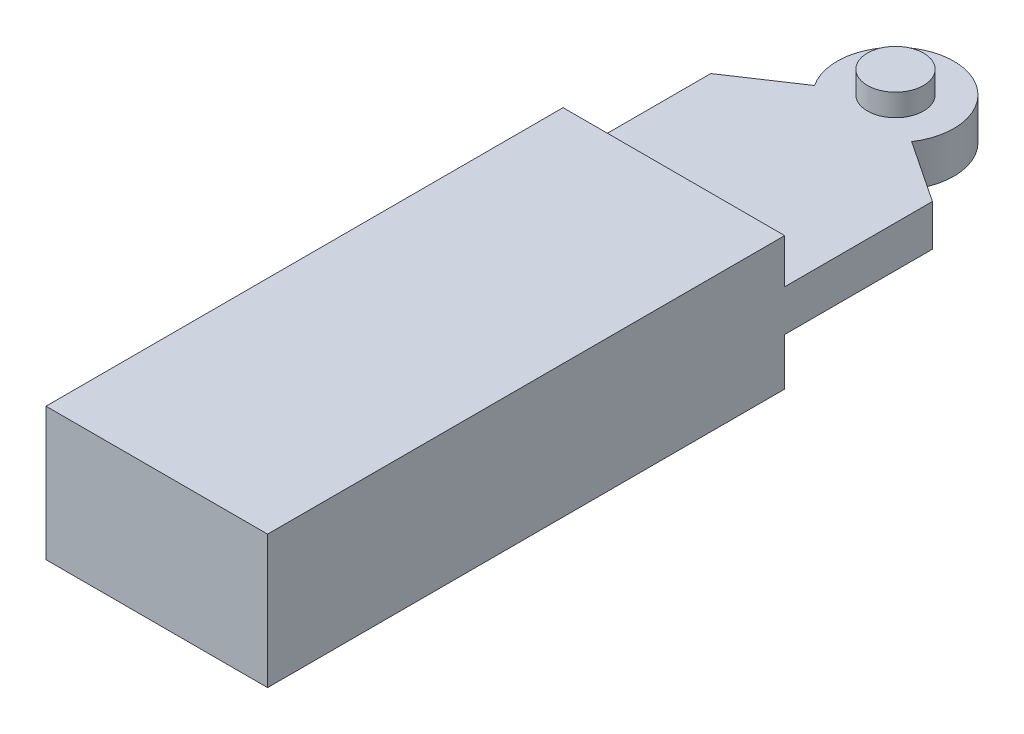
ISO-10303-21;
HEADER;
FILE_DESCRIPTION(('STEP AP214'),'2;1');
FILE_NAME('part.step','',(''),(''),'','','');
FILE_SCHEMA(('AUTOMOTIVE_DESIGN { 1 0 10303 214 1 1 1 1 }'));
ENDSEC;
DATA;
#1=APPLICATION_CONTEXT('core data for automotive mechanical design processes');
#2=APPLICATION_PROTOCOL_DEFINITION('international standard','automotive_design',2000,#1);
#3=PRODUCT_CONTEXT('',#1,'mechanical');
#4=PRODUCT('Part','Part','',(#3));
#5=PRODUCT_RELATED_PRODUCT_CATEGORY('part','',(#4));
#6=PRODUCT_DEFINITION_FORMATION('','',#4);
#7=PRODUCT_DEFINITION_CONTEXT('part definition',#1,'design');
#8=PRODUCT_DEFINITION('design','',#6,#7);
#9=PRODUCT_DEFINITION_SHAPE('','',#8);
#10=(LENGTH_UNIT() NAMED_UNIT(*) SI_UNIT(.MILLI.,.METRE.));
#11=(NAMED_UNIT(*) PLANE_ANGLE_UNIT() SI_UNIT($,.RADIAN.));
#12=(NAMED_UNIT(*) SI_UNIT($,.STERADIAN.) SOLID_ANGLE_UNIT());
#13=UNCERTAINTY_MEASURE_WITH_UNIT(LENGTH_MEASURE(1.E-05),#10,'distance_accuracy_value','');
#14=(GEOMETRIC_REPRESENTATION_CONTEXT(3) GLOBAL_UNCERTAINTY_ASSIGNED_CONTEXT((#13)) GLOBAL_UNIT_ASSIGNED_CONTEXT((#10,
#11,#12)) REPRESENTATION_CONTEXT('',''));
#15=CARTESIAN_POINT('',(0.,0.,0.));
#16=DIRECTION('',(0.,0.,1.));
#17=DIRECTION('',(1.,0.,0.));
#18=AXIS2_PLACEMENT_3D('',#15,#16,#17);
#19=CARTESIAN_POINT('',(0.,28.,0.));
#20=DIRECTION('',(0.,-1.,0.));
#21=DIRECTION('',(0.,0.,-1.));
#22=AXIS2_PLACEMENT_3D('',#19,#20,#21);
#23=CYLINDRICAL_SURFACE('',#22,39.5);
#24=DIRECTION('',(0.,-1.,0.));
#25=VECTOR('',#24,1.);
#26=CARTESIAN_POINT('',(32.8659866263448,28.,21.9106577508965));
#27=LINE('',#26,#25);
#28=CARTESIAN_POINT('',(32.8659866263448,0.,21.9106577508965));
#29=VERTEX_POINT('',#28);
#30=CARTESIAN_POINT('',(32.8659866263448,28.,21.9106577508965));
#31=VERTEX_POINT('',#30);
#32=EDGE_CURVE('E217',#29,#31,#27,.F.);
#33=ORIENTED_EDGE('',*,*,#32,.F.);
#34=CARTESIAN_POINT('',(0.,0.,0.));
#35=DIRECTION('',(0.,1.,0.));
#36=DIRECTION('',(0.,0.,1.));
#37=AXIS2_PLACEMENT_3D('',#34,#35,#36);
#38=CIRCLE('',#37,39.5);
#39=CARTESIAN_POINT('',(-32.8659866263448,0.,21.9106577508965));
#40=VERTEX_POINT('',#39);
#41=EDGE_CURVE('E236',#29,#40,#38,.T.);
#42=ORIENTED_EDGE('',*,*,#41,.T.);
#43=DIRECTION('',(0.,-1.,0.));
#44=VECTOR('',#43,1.);
#45=CARTESIAN_POINT('',(-32.8659866263448,28.,21.9106577508965));
#46=LINE('',#45,#44);
#47=CARTESIAN_POINT('',(-32.8659866263448,28.,21.9106577508965));
#48=VERTEX_POINT('',#47);
#49=EDGE_CURVE('E197',#48,#40,#46,.T.);
#50=ORIENTED_EDGE('',*,*,#49,.F.);
#51=CARTESIAN_POINT('',(0.,28.,0.));
#52=DIRECTION('',(0.,1.,0.));
#53=DIRECTION('',(0.,0.,1.));
#54=AXIS2_PLACEMENT_3D('',#51,#52,#53);
#55=CIRCLE('',#54,39.5);
#56=EDGE_CURVE('E232',#31,#48,#55,.T.);
#57=ORIENTED_EDGE('',*,*,#56,.F.);
#58=EDGE_LOOP('',(#33,#42,#50,#57));
#59=FACE_BOUND('',#58,.T.);
#60=ADVANCED_FACE('F44',(#59),#23,.T.);
#61=CARTESIAN_POINT('',(0.,28.,0.));
#62=DIRECTION('',(0.,1.,0.));
#63=DIRECTION('',(0.,0.,1.));
#64=AXIS2_PLACEMENT_3D('',#61,#62,#63);
#65=PLANE('',#64);
#66=DIRECTION('',(-1.,0.,0.));
#67=VECTOR('',#66,1.);
#68=CARTESIAN_POINT('',(0.,28.,150.));
#69=LINE('',#68,#67);
#70=CARTESIAN_POINT('',(75.,28.,150.));
#71=VERTEX_POINT('',#70);
#72=CARTESIAN_POINT('',(-75.,28.,150.));
#73=VERTEX_POINT('',#72);
#74=EDGE_CURVE('E58',#71,#73,#69,.T.);
#75=ORIENTED_EDGE('',*,*,#74,.F.);
#76=DIRECTION('',(0.,0.,-1.));
#77=VECTOR('',#76,1.);
#78=CARTESIAN_POINT('',(75.,28.,500.));
#79=LINE('',#78,#77);
#80=CARTESIAN_POINT('',(75.,28.,50.));
#81=VERTEX_POINT('',#80);
#82=EDGE_CURVE('E181',#71,#81,#79,.T.);
#83=ORIENTED_EDGE('',*,*,#82,.T.);
#84=DIRECTION('',(-0.832050294337844,0.,-0.554700196225229));
#85=VECTOR('',#84,1.);
#86=CARTESIAN_POINT('',(75.,28.,50.));
#87=LINE('',#86,#85);
#88=EDGE_CURVE('E203',#81,#31,#87,.T.);
#89=ORIENTED_EDGE('',*,*,#88,.T.);
#90=ORIENTED_EDGE('',*,*,#56,.T.);
#91=DIRECTION('',(-0.832050294337844,0.,0.554700196225229));
#92=VECTOR('',#91,1.);
#93=CARTESIAN_POINT('',(0.,28.,0.));
#94=LINE('',#93,#92);
#95=CARTESIAN_POINT('',(-75.,28.,50.));
#96=VERTEX_POINT('',#95);
#97=EDGE_CURVE('E196',#48,#96,#94,.T.);
#98=ORIENTED_EDGE('',*,*,#97,.T.);
#99=DIRECTION('',(0.,0.,1.));
#100=VECTOR('',#99,1.);
#101=CARTESIAN_POINT('',(-75.,28.,50.));
#102=LINE('',#101,#100);
#103=EDGE_CURVE('E192',#96,#73,#102,.T.);
#104=ORIENTED_EDGE('',*,*,#103,.T.);
#105=EDGE_LOOP('',(#75,#83,#89,#90,#98,#104));
#106=FACE_BOUND('',#105,.T.);
#107=CARTESIAN_POINT('',(0.,28.,0.));
#108=DIRECTION('',(0.,1.,0.));
#109=DIRECTION('',(0.,0.,1.));
#110=AXIS2_PLACEMENT_3D('',#107,#108,#109);
#111=CIRCLE('',#110,19.);
#112=CARTESIAN_POINT('',(0.,28.,19.));
#113=VERTEX_POINT('',#112);
#114=EDGE_CURVE('E52',#113,#113,#111,.T.);
#115=ORIENTED_EDGE('',*,*,#114,.F.);
#116=EDGE_LOOP('',(#115));
#117=FACE_BOUND('',#116,.T.);
#118=ADVANCED_FACE('F263',(#106,#117),#65,.T.);
#119=CARTESIAN_POINT('',(0.,0.,0.));
#120=DIRECTION('',(0.,1.,0.));
#121=DIRECTION('',(0.,0.,1.));
#122=AXIS2_PLACEMENT_3D('',#119,#120,#121);
#123=PLANE('',#122);
#124=CARTESIAN_POINT('',(0.,0.,0.));
#125=DIRECTION('',(0.,1.,0.));
#126=DIRECTION('',(0.,0.,1.));
#127=AXIS2_PLACEMENT_3D('',#124,#125,#126);
#128=CIRCLE('',#127,19.);
#129=CARTESIAN_POINT('',(0.,0.,19.));
#130=VERTEX_POINT('',#129);
#131=EDGE_CURVE('E227',#130,#130,#128,.T.);
#132=ORIENTED_EDGE('',*,*,#131,.T.);
#133=EDGE_LOOP('',(#132));
#134=FACE_BOUND('',#133,.T.);
#135=DIRECTION('',(0.,0.,-1.));
#136=VECTOR('',#135,1.);
#137=CARTESIAN_POINT('',(75.,0.,500.));
#138=LINE('',#137,#136);
#139=CARTESIAN_POINT('',(75.,0.,150.));
#140=VERTEX_POINT('',#139);
#141=CARTESIAN_POINT('',(75.,0.,50.));
#142=VERTEX_POINT('',#141);
#143=EDGE_CURVE('E179',#140,#142,#138,.T.);
#144=ORIENTED_EDGE('',*,*,#143,.F.);
#145=DIRECTION('',(-1.,0.,0.));
#146=VECTOR('',#145,1.);
#147=CARTESIAN_POINT('',(0.,0.,150.));
#148=LINE('',#147,#146);
#149=CARTESIAN_POINT('',(-75.,0.,150.));
#150=VERTEX_POINT('',#149);
#151=EDGE_CURVE('E11',#140,#150,#148,.T.);
#152=ORIENTED_EDGE('',*,*,#151,.T.);
#153=DIRECTION('',(0.,0.,1.));
#154=VECTOR('',#153,1.);
#155=CARTESIAN_POINT('',(-75.,0.,50.));
#156=LINE('',#155,#154);
#157=CARTESIAN_POINT('',(-75.,0.,50.));
#158=VERTEX_POINT('',#157);
#159=EDGE_CURVE('E132',#158,#150,#156,.T.);
#160=ORIENTED_EDGE('',*,*,#159,.F.);
#161=DIRECTION('',(-0.832050294337844,0.,0.554700196225229));
#162=VECTOR('',#161,1.);
#163=CARTESIAN_POINT('',(0.,0.,0.));
#164=LINE('',#163,#162);
#165=EDGE_CURVE('E186',#40,#158,#164,.T.);
#166=ORIENTED_EDGE('',*,*,#165,.F.);
#167=ORIENTED_EDGE('',*,*,#41,.F.);
#168=DIRECTION('',(-0.832050294337844,0.,-0.554700196225229));
#169=VECTOR('',#168,1.);
#170=CARTESIAN_POINT('',(75.,0.,50.));
#171=LINE('',#170,#169);
#172=EDGE_CURVE('E187',#142,#29,#171,.T.);
#173=ORIENTED_EDGE('',*,*,#172,.F.);
#174=EDGE_LOOP('',(#144,#152,#160,#166,#167,#173));
#175=FACE_BOUND('',#174,.T.);
#176=ADVANCED_FACE('F243',(#134,#175),#123,.F.);
#177=CARTESIAN_POINT('',(0.,-17.,0.));
#178=DIRECTION('',(0.,1.,0.));
#179=DIRECTION('',(0.,0.,1.));
#180=AXIS2_PLACEMENT_3D('',#177,#178,#179);
#181=PLANE('',#180);
#182=CARTESIAN_POINT('',(0.,-17.,0.));
#183=DIRECTION('',(0.,1.,0.));
#184=DIRECTION('',(0.,0.,1.));
#185=AXIS2_PLACEMENT_3D('',#182,#183,#184);
#186=CIRCLE('',#185,19.);
#187=CARTESIAN_POINT('',(0.,-17.,19.));
#188=VERTEX_POINT('',#187);
#189=EDGE_CURVE('E229',#188,#188,#186,.T.);
#190=ORIENTED_EDGE('',*,*,#189,.F.);
#191=EDGE_LOOP('',(#190));
#192=FACE_BOUND('',#191,.T.);
#193=ADVANCED_FACE('F249',(#192),#181,.F.);
#194=CARTESIAN_POINT('',(0.,-17.,0.));
#195=DIRECTION('',(0.,1.,0.));
#196=DIRECTION('',(0.,0.,1.));
#197=AXIS2_PLACEMENT_3D('',#194,#195,#196);
#198=CYLINDRICAL_SURFACE('',#197,19.);
#199=CARTESIAN_POINT('',(0.,-17.,19.));
#200=CARTESIAN_POINT('',(0.,-16.8229166666667,19.));
#201=CARTESIAN_POINT('',(0.,-16.6458333333333,19.));
#202=CARTESIAN_POINT('',(0.,-16.2916666666667,19.));
#203=CARTESIAN_POINT('',(0.,-16.1145833333333,19.));
#204=CARTESIAN_POINT('',(0.,-15.7604166666667,19.));
#205=CARTESIAN_POINT('',(0.,-15.5833333333333,19.));
#206=CARTESIAN_POINT('',(0.,-15.2291666666667,19.));
#207=CARTESIAN_POINT('',(0.,-15.0520833333333,19.));
#208=CARTESIAN_POINT('',(0.,-14.6979166666667,19.));
#209=CARTESIAN_POINT('',(0.,-14.5208333333333,19.));
#210=CARTESIAN_POINT('',(0.,-14.1666666666667,19.));
#211=CARTESIAN_POINT('',(0.,-13.9895833333333,19.));
#212=CARTESIAN_POINT('',(0.,-13.6354166666667,19.));
#213=CARTESIAN_POINT('',(0.,-13.4583333333333,19.));
#214=CARTESIAN_POINT('',(0.,-13.1041666666667,19.));
#215=CARTESIAN_POINT('',(0.,-12.9270833333333,19.));
#216=CARTESIAN_POINT('',(0.,-12.5729166666667,19.));
#217=CARTESIAN_POINT('',(0.,-12.3958333333333,19.));
#218=CARTESIAN_POINT('',(0.,-12.0416666666667,19.));
#219=CARTESIAN_POINT('',(0.,-11.8645833333333,19.));
#220=CARTESIAN_POINT('',(0.,-11.5104166666667,19.));
#221=CARTESIAN_POINT('',(0.,-11.3333333333333,19.));
#222=CARTESIAN_POINT('',(0.,-10.9791666666667,19.));
#223=CARTESIAN_POINT('',(0.,-10.8020833333333,19.));
#224=CARTESIAN_POINT('',(0.,-10.4479166666667,19.));
#225=CARTESIAN_POINT('',(0.,-10.2708333333333,19.));
#226=CARTESIAN_POINT('',(0.,-9.91666666666667,19.));
#227=CARTESIAN_POINT('',(0.,-9.73958333333333,19.));
#228=CARTESIAN_POINT('',(0.,-9.38541666666667,19.));
#229=CARTESIAN_POINT('',(0.,-9.20833333333333,19.));
#230=CARTESIAN_POINT('',(0.,-8.85416666666667,19.));
#231=CARTESIAN_POINT('',(0.,-8.67708333333333,19.));
#232=CARTESIAN_POINT('',(0.,-8.32291666666667,19.));
#233=CARTESIAN_POINT('',(0.,-8.14583333333333,19.));
#234=CARTESIAN_POINT('',(0.,-7.79166666666667,19.));
#235=CARTESIAN_POINT('',(0.,-7.61458333333333,19.));
#236=CARTESIAN_POINT('',(0.,-7.26041666666667,19.));
#237=CARTESIAN_POINT('',(0.,-7.08333333333333,19.));
#238=CARTESIAN_POINT('',(0.,-6.72916666666667,19.));
#239=CARTESIAN_POINT('',(0.,-6.55208333333333,19.));
#240=CARTESIAN_POINT('',(0.,-6.19791666666667,19.));
#241=CARTESIAN_POINT('',(0.,-6.02083333333333,19.));
#242=CARTESIAN_POINT('',(0.,-5.66666666666667,19.));
#243=CARTESIAN_POINT('',(0.,-5.48958333333333,19.));
#244=CARTESIAN_POINT('',(0.,-5.13541666666667,19.));
#245=CARTESIAN_POINT('',(0.,-4.95833333333333,19.));
#246=CARTESIAN_POINT('',(0.,-4.60416666666667,19.));
#247=CARTESIAN_POINT('',(0.,-4.42708333333333,19.));
#248=CARTESIAN_POINT('',(0.,-4.07291666666667,19.));
#249=CARTESIAN_POINT('',(0.,-3.89583333333333,19.));
#250=CARTESIAN_POINT('',(0.,-3.54166666666667,19.));
#251=CARTESIAN_POINT('',(0.,-3.36458333333333,19.));
#252=CARTESIAN_POINT('',(0.,-3.01041666666667,19.));
#253=CARTESIAN_POINT('',(0.,-2.83333333333333,19.));
#254=CARTESIAN_POINT('',(0.,-2.47916666666667,19.));
#255=CARTESIAN_POINT('',(0.,-2.30208333333333,19.));
#256=CARTESIAN_POINT('',(0.,-1.94791666666667,19.));
#257=CARTESIAN_POINT('',(0.,-1.77083333333333,19.));
#258=CARTESIAN_POINT('',(0.,-1.41666666666667,19.));
#259=CARTESIAN_POINT('',(0.,-1.23958333333333,19.));
#260=CARTESIAN_POINT('',(0.,-0.885416666666668,19.));
#261=CARTESIAN_POINT('',(0.,-0.708333333333334,19.));
#262=CARTESIAN_POINT('',(0.,-0.354166666666667,19.));
#263=CARTESIAN_POINT('',(0.,-0.177083333333333,19.));
#264=CARTESIAN_POINT('',(0.,0.,19.));
#265=B_SPLINE_CURVE_WITH_KNOTS('',3,(#199,#200,#201,#202,#203,#204,#205,#206,#207,#208,#209,
#210,#211,#212,#213,#214,#215,#216,#217,#218,#219,#220,#221,#222,#223,#224,#225,#226,#227,#228,
#229,#230,#231,#232,#233,#234,#235,#236,#237,#238,#239,#240,#241,#242,#243,#244,#245,#246,#247,
#248,#249,#250,#251,#252,#253,#254,#255,#256,#257,#258,#259,#260,#261,#262,#263,#264),
.UNSPECIFIED.,.F.,.F.,(4,2,2,2,2,2,2,2,2,2,2,2,2,2,2,2,2,2,2,2,2,2,2,2,2,2,2,2,2,2,2,2,4),(0.,
0.531249999999997,1.0625,1.59375,2.125,2.65625,3.1875,3.71875,4.25,4.78125,5.3125,5.84375,6.375,
6.90625,7.4375,7.96875,8.5,9.03125,9.5625,10.09375,10.625,11.15625,11.6875,12.21875,12.75,
13.28125,13.8125,14.34375,14.875,15.40625,15.9375,16.46875,17.),.UNSPECIFIED.);
#266=EDGE_CURVE('BSEAM250',#188,#130,#265,.T.);
#267=ORIENTED_EDGE('',*,*,#189,.T.);
#268=ORIENTED_EDGE('',*,*,#131,.F.);
#269=ORIENTED_EDGE('',*,*,#266,.T.);
#270=ORIENTED_EDGE('',*,*,#266,.F.);
#271=EDGE_LOOP('',(#267,#269,#268,#270));
#272=FACE_BOUND('',#271,.T.);
#273=ADVANCED_FACE('F250',(#272),#198,.T.);
#274=CARTESIAN_POINT('',(0.,43.,0.));
#275=DIRECTION('',(0.,1.,0.));
#276=DIRECTION('',(0.,0.,1.));
#277=AXIS2_PLACEMENT_3D('',#274,#275,#276);
#278=CIRCLE('',#277,19.);
#279=CARTESIAN_POINT('',(0.,43.,19.));
#280=VERTEX_POINT('',#279);
#281=EDGE_CURVE('E225',#280,#280,#278,.T.);
#282=CARTESIAN_POINT('',(0.,28.,19.));
#283=CARTESIAN_POINT('',(0.,28.15625,19.));
#284=CARTESIAN_POINT('',(0.,28.3125,19.));
#285=CARTESIAN_POINT('',(0.,28.625,19.));
#286=CARTESIAN_POINT('',(0.,28.78125,19.));
#287=CARTESIAN_POINT('',(0.,29.09375,19.));
#288=CARTESIAN_POINT('',(0.,29.25,19.));
#289=CARTESIAN_POINT('',(0.,29.5625,19.));
#290=CARTESIAN_POINT('',(0.,29.71875,19.));
#291=CARTESIAN_POINT('',(0.,30.03125,19.));
#292=CARTESIAN_POINT('',(0.,30.1875,19.));
#293=CARTESIAN_POINT('',(0.,30.5,19.));
#294=CARTESIAN_POINT('',(0.,30.65625,19.));
#295=CARTESIAN_POINT('',(0.,30.96875,19.));
#296=CARTESIAN_POINT('',(0.,31.125,19.));
#297=CARTESIAN_POINT('',(0.,31.4375,19.));
#298=CARTESIAN_POINT('',(0.,31.59375,19.));
#299=CARTESIAN_POINT('',(0.,31.90625,19.));
#300=CARTESIAN_POINT('',(0.,32.0625,19.));
#301=CARTESIAN_POINT('',(0.,32.375,19.));
#302=CARTESIAN_POINT('',(0.,32.53125,19.));
#303=CARTESIAN_POINT('',(0.,32.84375,19.));
#304=CARTESIAN_POINT('',(0.,33.,19.));
#305=CARTESIAN_POINT('',(0.,33.3125,19.));
#306=CARTESIAN_POINT('',(0.,33.46875,19.));
#307=CARTESIAN_POINT('',(0.,33.78125,19.));
#308=CARTESIAN_POINT('',(0.,33.9375,19.));
#309=CARTESIAN_POINT('',(0.,34.25,19.));
#310=CARTESIAN_POINT('',(0.,34.40625,19.));
#311=CARTESIAN_POINT('',(0.,34.71875,19.));
#312=CARTESIAN_POINT('',(0.,34.875,19.));
#313=CARTESIAN_POINT('',(0.,35.1875,19.));
#314=CARTESIAN_POINT('',(0.,35.34375,19.));
#315=CARTESIAN_POINT('',(0.,35.65625,19.));
#316=CARTESIAN_POINT('',(0.,35.8125,19.));
#317=CARTESIAN_POINT('',(0.,36.125,19.));
#318=CARTESIAN_POINT('',(0.,36.28125,19.));
#319=CARTESIAN_POINT('',(0.,36.59375,19.));
#320=CARTESIAN_POINT('',(0.,36.75,19.));
#321=CARTESIAN_POINT('',(0.,37.0625,19.));
#322=CARTESIAN_POINT('',(0.,37.21875,19.));
#323=CARTESIAN_POINT('',(0.,37.53125,19.));
#324=CARTESIAN_POINT('',(0.,37.6875,19.));
#325=CARTESIAN_POINT('',(0.,38.,19.));
#326=CARTESIAN_POINT('',(0.,38.15625,19.));
#327=CARTESIAN_POINT('',(0.,38.46875,19.));
#328=CARTESIAN_POINT('',(0.,38.625,19.));
#329=CARTESIAN_POINT('',(0.,38.9375,19.));
#330=CARTESIAN_POINT('',(0.,39.09375,19.));
#331=CARTESIAN_POINT('',(0.,39.40625,19.));
#332=CARTESIAN_POINT('',(0.,39.5625,19.));
#333=CARTESIAN_POINT('',(0.,39.875,19.));
#334=CARTESIAN_POINT('',(0.,40.03125,19.));
#335=CARTESIAN_POINT('',(0.,40.34375,19.));
#336=CARTESIAN_POINT('',(0.,40.5,19.));
#337=CARTESIAN_POINT('',(0.,40.8125,19.));
#338=CARTESIAN_POINT('',(0.,40.96875,19.));
#339=CARTESIAN_POINT('',(0.,41.28125,19.));
#340=CARTESIAN_POINT('',(0.,41.4375,19.));
#341=CARTESIAN_POINT('',(0.,41.75,19.));
#342=CARTESIAN_POINT('',(0.,41.90625,19.));
#343=CARTESIAN_POINT('',(0.,42.21875,19.));
#344=CARTESIAN_POINT('',(0.,42.375,19.));
#345=CARTESIAN_POINT('',(0.,42.6875,19.));
#346=CARTESIAN_POINT('',(0.,42.84375,19.));
#347=CARTESIAN_POINT('',(0.,43.,19.));
#348=B_SPLINE_CURVE_WITH_KNOTS('',3,(#282,#283,#284,#285,#286,#287,#288,#289,#290,#291,#292,
#293,#294,#295,#296,#297,#298,#299,#300,#301,#302,#303,#304,#305,#306,#307,#308,#309,#310,#311,
#312,#313,#314,#315,#316,#317,#318,#319,#320,#321,#322,#323,#324,#325,#326,#327,#328,#329,#330,
#331,#332,#333,#334,#335,#336,#337,#338,#339,#340,#341,#342,#343,#344,#345,#346,#347),
.UNSPECIFIED.,.F.,.F.,(4,2,2,2,2,2,2,2,2,2,2,2,2,2,2,2,2,2,2,2,2,2,2,2,2,2,2,2,2,2,2,2,4),(0.,
0.468749999999997,0.937500000000001,1.40625,1.875,2.34375,2.8125,3.28125,3.75000000000001,
4.21875,4.6875,5.15625,5.62499999999999,6.09375,6.5625,7.03125000000001,7.5,7.96875,8.4375,
8.90624999999999,9.375,9.84375,10.3125,10.78125,11.25,11.71875,12.1875,12.65625,13.125,13.59375,
14.0625,14.53125,15.),.UNSPECIFIED.);
#349=EDGE_CURVE('BSEAM247',#113,#280,#348,.T.);
#350=ORIENTED_EDGE('',*,*,#114,.T.);
#351=ORIENTED_EDGE('',*,*,#281,.F.);
#352=ORIENTED_EDGE('',*,*,#349,.T.);
#353=ORIENTED_EDGE('',*,*,#349,.F.);
#354=EDGE_LOOP('',(#350,#352,#351,#353));
#355=FACE_BOUND('',#354,.T.);
#356=ADVANCED_FACE('F247',(#355),#198,.T.);
#357=CARTESIAN_POINT('',(0.,43.,0.));
#358=DIRECTION('',(0.,1.,0.));
#359=DIRECTION('',(0.,0.,1.));
#360=AXIS2_PLACEMENT_3D('',#357,#358,#359);
#361=PLANE('',#360);
#362=ORIENTED_EDGE('',*,*,#281,.T.);
#363=EDGE_LOOP('',(#362));
#364=FACE_BOUND('',#363,.T.);
#365=ADVANCED_FACE('F260',(#364),#361,.T.);
#366=CARTESIAN_POINT('',(75.,550.015325445528,50.));
#367=DIRECTION('',(-0.554700196225229,0.,0.832050294337844));
#368=DIRECTION('',(0.832050294337844,0.,0.554700196225229));
#369=AXIS2_PLACEMENT_3D('',#366,#367,#368);
#370=PLANE('',#369);
#371=ORIENTED_EDGE('',*,*,#172,.T.);
#372=ORIENTED_EDGE('',*,*,#32,.T.);
#373=ORIENTED_EDGE('',*,*,#88,.F.);
#374=DIRECTION('',(0.,-1.,0.));
#375=VECTOR('',#374,1.);
#376=CARTESIAN_POINT('',(75.,550.015325445528,50.));
#377=LINE('',#376,#375);
#378=EDGE_CURVE('E177',#81,#142,#377,.T.);
#379=ORIENTED_EDGE('',*,*,#378,.T.);
#380=EDGE_LOOP('',(#371,#372,#373,#379));
#381=FACE_BOUND('',#380,.T.);
#382=ADVANCED_FACE('F277',(#381),#370,.F.);
#383=CARTESIAN_POINT('',(0.,550.015325445528,0.));
#384=DIRECTION('',(0.554700196225229,0.,0.832050294337844));
#385=DIRECTION('',(0.832050294337844,0.,-0.554700196225229));
#386=AXIS2_PLACEMENT_3D('',#383,#384,#385);
#387=PLANE('',#386);
#388=ORIENTED_EDGE('',*,*,#97,.F.);
#389=ORIENTED_EDGE('',*,*,#49,.T.);
#390=ORIENTED_EDGE('',*,*,#165,.T.);
#391=DIRECTION('',(0.,-1.,0.));
#392=VECTOR('',#391,1.);
#393=CARTESIAN_POINT('',(-75.,550.015325445528,50.));
#394=LINE('',#393,#392);
#395=EDGE_CURVE('E189',#96,#158,#394,.T.);
#396=ORIENTED_EDGE('',*,*,#395,.F.);
#397=EDGE_LOOP('',(#388,#389,#390,#396));
#398=FACE_BOUND('',#397,.T.);
#399=ADVANCED_FACE('F282',(#398),#387,.F.);
#400=CARTESIAN_POINT('',(-75.,550.015325445528,50.));
#401=DIRECTION('',(1.,0.,0.));
#402=DIRECTION('',(0.,0.,-1.));
#403=AXIS2_PLACEMENT_3D('',#400,#401,#402);
#404=PLANE('',#403);
#405=ORIENTED_EDGE('',*,*,#159,.T.);
#406=DIRECTION('',(0.,1.,0.));
#407=VECTOR('',#406,1.);
#408=CARTESIAN_POINT('',(-75.,-32.,150.));
#409=LINE('',#408,#407);
#410=CARTESIAN_POINT('',(-75.,-32.,150.));
#411=VERTEX_POINT('',#410);
#412=EDGE_CURVE('E66',#411,#150,#409,.T.);
#413=ORIENTED_EDGE('',*,*,#412,.F.);
#414=DIRECTION('',(0.,0.,1.));
#415=VECTOR('',#414,1.);
#416=CARTESIAN_POINT('',(-75.,-32.,500.));
#417=LINE('',#416,#415);
#418=CARTESIAN_POINT('',(-75.,-32.,500.));
#419=VERTEX_POINT('',#418);
#420=EDGE_CURVE('E129',#411,#419,#417,.T.);
#421=ORIENTED_EDGE('',*,*,#420,.T.);
#422=DIRECTION('',(0.,-1.,0.));
#423=VECTOR('',#422,1.);
#424=CARTESIAN_POINT('',(-75.,550.015325445528,500.));
#425=LINE('',#424,#423);
#426=CARTESIAN_POINT('',(-75.,58.,500.));
#427=VERTEX_POINT('',#426);
#428=EDGE_CURVE('E123',#427,#419,#425,.T.);
#429=ORIENTED_EDGE('',*,*,#428,.F.);
#430=DIRECTION('',(0.,0.,1.));
#431=VECTOR('',#430,1.);
#432=CARTESIAN_POINT('',(-75.,58.,500.));
#433=LINE('',#432,#431);
#434=CARTESIAN_POINT('',(-75.,58.,150.));
#435=VERTEX_POINT('',#434);
#436=EDGE_CURVE('E130',#435,#427,#433,.T.);
#437=ORIENTED_EDGE('',*,*,#436,.F.);
#438=EDGE_CURVE('E171',#73,#435,#409,.T.);
#439=ORIENTED_EDGE('',*,*,#438,.F.);
#440=ORIENTED_EDGE('',*,*,#103,.F.);
#441=ORIENTED_EDGE('',*,*,#395,.T.);
#442=EDGE_LOOP('',(#405,#413,#421,#429,#437,#439,#440,#441));
#443=FACE_BOUND('',#442,.T.);
#444=ADVANCED_FACE('F122',(#443),#404,.F.);
#445=CARTESIAN_POINT('',(-75.,550.015325445528,500.));
#446=DIRECTION('',(0.,0.,-1.));
#447=DIRECTION('',(-1.,0.,0.));
#448=AXIS2_PLACEMENT_3D('',#445,#446,#447);
#449=PLANE('',#448);
#450=DIRECTION('',(0.,-1.,0.));
#451=VECTOR('',#450,1.);
#452=CARTESIAN_POINT('',(75.,550.015325445528,500.));
#453=LINE('',#452,#451);
#454=CARTESIAN_POINT('',(75.,58.,500.));
#455=VERTEX_POINT('',#454);
#456=CARTESIAN_POINT('',(75.,-32.,500.));
#457=VERTEX_POINT('',#456);
#458=EDGE_CURVE('E133',#455,#457,#453,.T.);
#459=ORIENTED_EDGE('',*,*,#458,.F.);
#460=DIRECTION('',(1.,0.,0.));
#461=VECTOR('',#460,1.);
#462=CARTESIAN_POINT('',(-75.,58.,500.));
#463=LINE('',#462,#461);
#464=EDGE_CURVE('E136',#427,#455,#463,.T.);
#465=ORIENTED_EDGE('',*,*,#464,.F.);
#466=ORIENTED_EDGE('',*,*,#428,.T.);
#467=DIRECTION('',(1.,0.,0.));
#468=VECTOR('',#467,1.);
#469=CARTESIAN_POINT('',(-75.,-32.,500.));
#470=LINE('',#469,#468);
#471=EDGE_CURVE('E157',#419,#457,#470,.T.);
#472=ORIENTED_EDGE('',*,*,#471,.T.);
#473=EDGE_LOOP('',(#459,#465,#466,#472));
#474=FACE_BOUND('',#473,.T.);
#475=ADVANCED_FACE('F137',(#474),#449,.F.);
#476=CARTESIAN_POINT('',(75.,550.015325445528,500.));
#477=DIRECTION('',(-1.,0.,0.));
#478=DIRECTION('',(0.,0.,1.));
#479=AXIS2_PLACEMENT_3D('',#476,#477,#478);
#480=PLANE('',#479);
#481=ORIENTED_EDGE('',*,*,#458,.T.);
#482=DIRECTION('',(0.,0.,-1.));
#483=VECTOR('',#482,1.);
#484=CARTESIAN_POINT('',(75.,-32.,500.));
#485=LINE('',#484,#483);
#486=CARTESIAN_POINT('',(75.,-32.,150.));
#487=VERTEX_POINT('',#486);
#488=EDGE_CURVE('E165',#457,#487,#485,.T.);
#489=ORIENTED_EDGE('',*,*,#488,.T.);
#490=DIRECTION('',(0.,1.,0.));
#491=VECTOR('',#490,1.);
#492=CARTESIAN_POINT('',(75.,-32.,150.));
#493=LINE('',#492,#491);
#494=EDGE_CURVE('E175',#487,#140,#493,.T.);
#495=ORIENTED_EDGE('',*,*,#494,.T.);
#496=ORIENTED_EDGE('',*,*,#143,.T.);
#497=ORIENTED_EDGE('',*,*,#378,.F.);
#498=ORIENTED_EDGE('',*,*,#82,.F.);
#499=CARTESIAN_POINT('',(75.,58.,150.));
#500=VERTEX_POINT('',#499);
#501=EDGE_CURVE('E166',#71,#500,#493,.T.);
#502=ORIENTED_EDGE('',*,*,#501,.T.);
#503=DIRECTION('',(0.,0.,-1.));
#504=VECTOR('',#503,1.);
#505=CARTESIAN_POINT('',(75.,58.,500.));
#506=LINE('',#505,#504);
#507=EDGE_CURVE('E145',#455,#500,#506,.T.);
#508=ORIENTED_EDGE('',*,*,#507,.F.);
#509=EDGE_LOOP('',(#481,#489,#495,#496,#497,#498,#502,#508));
#510=FACE_BOUND('',#509,.T.);
#511=ADVANCED_FACE('F276',(#510),#480,.F.);
#512=CARTESIAN_POINT('',(0.,-32.,0.));
#513=DIRECTION('',(0.,-1.,0.));
#514=DIRECTION('',(0.,0.,-1.));
#515=AXIS2_PLACEMENT_3D('',#512,#513,#514);
#516=PLANE('',#515);
#517=ORIENTED_EDGE('',*,*,#420,.F.);
#518=DIRECTION('',(-1.,0.,0.));
#519=VECTOR('',#518,1.);
#520=CARTESIAN_POINT('',(-75.,-32.,150.));
#521=LINE('',#520,#519);
#522=EDGE_CURVE('E167',#487,#411,#521,.T.);
#523=ORIENTED_EDGE('',*,*,#522,.F.);
#524=ORIENTED_EDGE('',*,*,#488,.F.);
#525=ORIENTED_EDGE('',*,*,#471,.F.);
#526=EDGE_LOOP('',(#517,#523,#524,#525));
#527=FACE_BOUND('',#526,.T.);
#528=ADVANCED_FACE('F294',(#527),#516,.T.);
#529=CARTESIAN_POINT('',(-75.,-32.,150.));
#530=DIRECTION('',(0.,0.,-1.));
#531=DIRECTION('',(-1.,0.,0.));
#532=AXIS2_PLACEMENT_3D('',#529,#530,#531);
#533=PLANE('',#532);
#534=ORIENTED_EDGE('',*,*,#151,.F.);
#535=ORIENTED_EDGE('',*,*,#494,.F.);
#536=ORIENTED_EDGE('',*,*,#522,.T.);
#537=ORIENTED_EDGE('',*,*,#412,.T.);
#538=EDGE_LOOP('',(#534,#535,#536,#537));
#539=FACE_BOUND('',#538,.T.);
#540=ADVANCED_FACE('F293',(#539),#533,.T.);
#541=ORIENTED_EDGE('',*,*,#501,.F.);
#542=ORIENTED_EDGE('',*,*,#74,.T.);
#543=ORIENTED_EDGE('',*,*,#438,.T.);
#544=DIRECTION('',(-1.,0.,0.));
#545=VECTOR('',#544,1.);
#546=CARTESIAN_POINT('',(-75.,58.,150.));
#547=LINE('',#546,#545);
#548=EDGE_CURVE('E149',#500,#435,#547,.T.);
#549=ORIENTED_EDGE('',*,*,#548,.F.);
#550=EDGE_LOOP('',(#541,#542,#543,#549));
#551=FACE_BOUND('',#550,.T.);
#552=ADVANCED_FACE('F286',(#551),#533,.T.);
#553=CARTESIAN_POINT('',(0.,58.,0.));
#554=DIRECTION('',(0.,-1.,0.));
#555=DIRECTION('',(0.,0.,-1.));
#556=AXIS2_PLACEMENT_3D('',#553,#554,#555);
#557=PLANE('',#556);
#558=ORIENTED_EDGE('',*,*,#436,.T.);
#559=ORIENTED_EDGE('',*,*,#464,.T.);
#560=ORIENTED_EDGE('',*,*,#507,.T.);
#561=ORIENTED_EDGE('',*,*,#548,.T.);
#562=EDGE_LOOP('',(#558,#559,#560,#561));
#563=FACE_BOUND('',#562,.T.);
#564=ADVANCED_FACE('F150',(#563),#557,.F.);
#565=CLOSED_SHELL('',(#60,#118,#176,#193,#273,#356,#365,#382,#399,#444,#475,#511,#528,#540,#552,#564));
#566=MANIFOLD_SOLID_BREP('B2',#565);
#567=ADVANCED_BREP_SHAPE_REPRESENTATION('',(#18,#566),#14);
#568=SHAPE_DEFINITION_REPRESENTATION(#9,#567);
ENDSEC;
END-ISO-10303-21;
